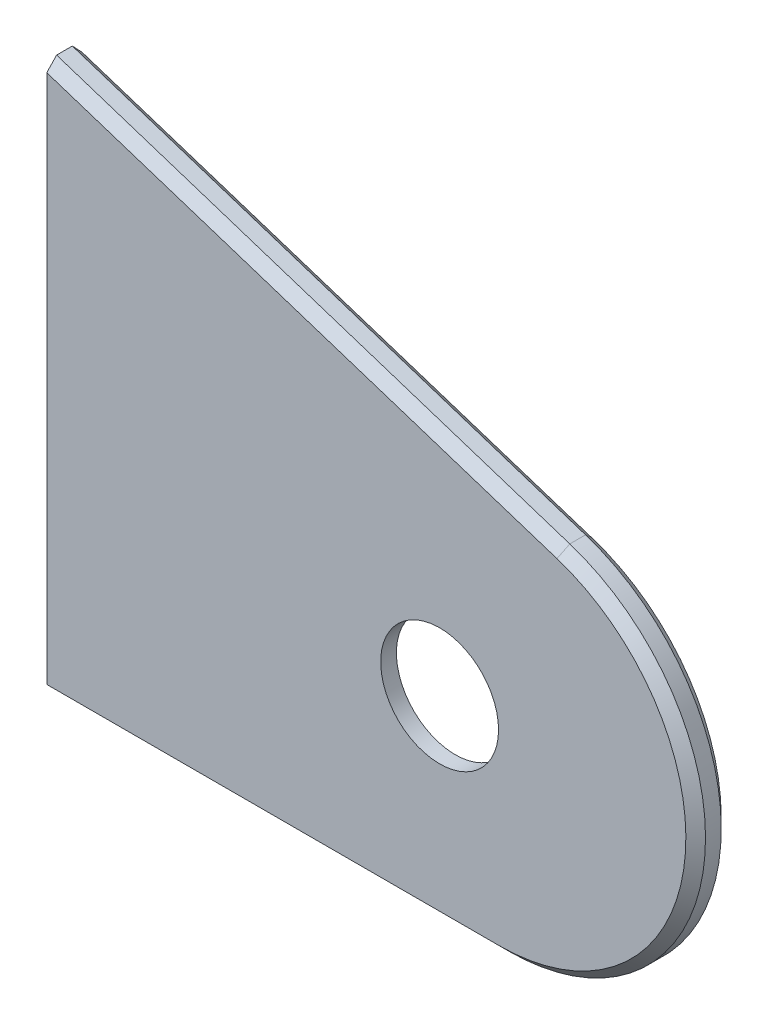
ISO-10303-21;
HEADER;
FILE_DESCRIPTION(('STEP AP214'),'2;1');
FILE_NAME('part.step','',(''),(''),'','','');
FILE_SCHEMA(('AUTOMOTIVE_DESIGN { 1 0 10303 214 1 1 1 1 }'));
ENDSEC;
DATA;
#1=APPLICATION_CONTEXT('core data for automotive mechanical design processes');
#2=APPLICATION_PROTOCOL_DEFINITION('international standard','automotive_design',2000,#1);
#3=PRODUCT_CONTEXT('',#1,'mechanical');
#4=PRODUCT('Part','Part','',(#3));
#5=PRODUCT_RELATED_PRODUCT_CATEGORY('part','',(#4));
#6=PRODUCT_DEFINITION_FORMATION('','',#4);
#7=PRODUCT_DEFINITION_CONTEXT('part definition',#1,'design');
#8=PRODUCT_DEFINITION('design','',#6,#7);
#9=PRODUCT_DEFINITION_SHAPE('','',#8);
#10=(LENGTH_UNIT() NAMED_UNIT(*) SI_UNIT(.MILLI.,.METRE.));
#11=(NAMED_UNIT(*) PLANE_ANGLE_UNIT() SI_UNIT($,.RADIAN.));
#12=(NAMED_UNIT(*) SI_UNIT($,.STERADIAN.) SOLID_ANGLE_UNIT());
#13=UNCERTAINTY_MEASURE_WITH_UNIT(LENGTH_MEASURE(1.E-05),#10,'distance_accuracy_value','');
#14=(GEOMETRIC_REPRESENTATION_CONTEXT(3) GLOBAL_UNCERTAINTY_ASSIGNED_CONTEXT((#13)) GLOBAL_UNIT_ASSIGNED_CONTEXT((#10,
#11,#12)) REPRESENTATION_CONTEXT('',''));
#15=CARTESIAN_POINT('',(0.,0.,0.));
#16=DIRECTION('',(0.,0.,1.));
#17=DIRECTION('',(1.,0.,0.));
#18=AXIS2_PLACEMENT_3D('',#15,#16,#17);
#19=CARTESIAN_POINT('',(0.,0.,0.));
#20=DIRECTION('',(0.,0.,-1.));
#21=DIRECTION('',(-1.,0.,0.));
#22=AXIS2_PLACEMENT_3D('',#19,#20,#21);
#23=PLANE('',#22);
#24=DIRECTION('',(1.,0.,0.));
#25=VECTOR('',#24,1.);
#26=CARTESIAN_POINT('',(30.,10.,0.));
#27=LINE('',#26,#25);
#28=CARTESIAN_POINT('',(47.3205080756887,10.,0.));
#29=VERTEX_POINT('',#28);
#30=CARTESIAN_POINT('',(230.376238941563,10.,0.));
#31=VERTEX_POINT('',#30);
#32=EDGE_CURVE('E212',#29,#31,#27,.T.);
#33=ORIENTED_EDGE('',*,*,#32,.F.);
#34=CARTESIAN_POINT('',(47.3205080756888,20.,0.));
#35=DIRECTION('',(0.,0.,-1.));
#36=DIRECTION('',(-1.,0.,0.));
#37=AXIS2_PLACEMENT_3D('',#34,#35,#36);
#38=CIRCLE('',#37,10.);
#39=CARTESIAN_POINT('',(38.6602540378444,25.,0.));
#40=VERTEX_POINT('',#39);
#41=EDGE_CURVE('E281',#29,#40,#38,.T.);
#42=ORIENTED_EDGE('',*,*,#41,.T.);
#43=DIRECTION('',(-0.499999999999998,-0.86602540378444,0.));
#44=VECTOR('',#43,1.);
#45=CARTESIAN_POINT('',(30.,10.,0.));
#46=LINE('',#45,#44);
#47=CARTESIAN_POINT('',(147.361565015534,213.276193462705,0.));
#48=VERTEX_POINT('',#47);
#49=EDGE_CURVE('E209',#48,#40,#46,.T.);
#50=ORIENTED_EDGE('',*,*,#49,.F.);
#51=CARTESIAN_POINT('',(156.021819053379,208.276193462705,0.));
#52=DIRECTION('',(0.,0.,-1.));
#53=DIRECTION('',(-1.,0.,0.));
#54=AXIS2_PLACEMENT_3D('',#51,#52,#53);
#55=CIRCLE('',#54,10.);
#56=CARTESIAN_POINT('',(159.111988997128,217.786758625656,0.));
#57=VERTEX_POINT('',#56);
#58=EDGE_CURVE('E279',#48,#57,#55,.T.);
#59=ORIENTED_EDGE('',*,*,#58,.T.);
#60=DIRECTION('',(-0.951056516295152,0.309016994374952,0.));
#61=VECTOR('',#60,1.);
#62=CARTESIAN_POINT('',(151.410485181509,220.289128905964,0.));
#63=LINE('',#62,#61);
#64=CARTESIAN_POINT('',(258.187768435309,185.595086466564,0.));
#65=VERTEX_POINT('',#64);
#66=EDGE_CURVE('E216',#65,#57,#63,.T.);
#67=ORIENTED_EDGE('',*,*,#66,.F.);
#68=CARTESIAN_POINT('',(230.376238941563,100.,0.));
#69=DIRECTION('',(0.,0.,1.));
#70=DIRECTION('',(1.,0.,0.));
#71=AXIS2_PLACEMENT_3D('',#68,#69,#70);
#72=CIRCLE('',#71,90.);
#73=EDGE_CURVE('E186',#31,#65,#72,.T.);
#74=ORIENTED_EDGE('',*,*,#73,.F.);
#75=EDGE_LOOP('',(#33,#42,#50,#59,#67,#74));
#76=FACE_BOUND('',#75,.T.);
#77=CARTESIAN_POINT('',(200.,99.9999999999999,0.));
#78=DIRECTION('',(0.,0.,1.));
#79=DIRECTION('',(1.,0.,0.));
#80=AXIS2_PLACEMENT_3D('',#77,#78,#79);
#81=CIRCLE('',#80,30.);
#82=CARTESIAN_POINT('',(230.,99.9999999999999,0.));
#83=VERTEX_POINT('',#82);
#84=EDGE_CURVE('E239',#83,#83,#81,.T.);
#85=ORIENTED_EDGE('',*,*,#84,.T.);
#86=EDGE_LOOP('',(#85));
#87=FACE_BOUND('',#86,.T.);
#88=ADVANCED_FACE('F36',(#76,#87),#23,.T.);
#89=CARTESIAN_POINT('',(0.,0.,8.));
#90=DIRECTION('',(0.,0.,-1.));
#91=DIRECTION('',(-1.,0.,0.));
#92=AXIS2_PLACEMENT_3D('',#89,#90,#91);
#93=PLANE('',#92);
#94=DIRECTION('',(0.,-1.,0.));
#95=VECTOR('',#94,1.);
#96=CARTESIAN_POINT('',(0.,0.,8.));
#97=LINE('',#96,#95);
#98=CARTESIAN_POINT('',(0.,274.742688878809,8.));
#99=VERTEX_POINT('',#98);
#100=CARTESIAN_POINT('',(0.,5.00000000000012,8.));
#101=VERTEX_POINT('',#100);
#102=EDGE_CURVE('E243',#99,#101,#97,.T.);
#103=ORIENTED_EDGE('',*,*,#102,.T.);
#104=DIRECTION('',(1.,0.,0.));
#105=VECTOR('',#104,1.);
#106=CARTESIAN_POINT('',(0.,5.00000000000012,8.));
#107=LINE('',#106,#105);
#108=CARTESIAN_POINT('',(230.376238941563,5.0000000000001,8.));
#109=VERTEX_POINT('',#108);
#110=EDGE_CURVE('E11',#101,#109,#107,.T.);
#111=ORIENTED_EDGE('',*,*,#110,.T.);
#112=CARTESIAN_POINT('',(230.376238941563,100.,8.));
#113=DIRECTION('',(0.,0.,-1.));
#114=DIRECTION('',(-1.,0.,0.));
#115=AXIS2_PLACEMENT_3D('',#112,#113,#114);
#116=CIRCLE('',#115,94.9999999999999);
#117=CARTESIAN_POINT('',(259.732853407183,190.350369048039,8.));
#118=VERTEX_POINT('',#117);
#119=EDGE_CURVE('E53',#109,#118,#116,.F.);
#120=ORIENTED_EDGE('',*,*,#119,.T.);
#121=DIRECTION('',(-0.951056516295152,0.309016994374951,0.));
#122=VECTOR('',#121,1.);
#123=CARTESIAN_POINT('',(80.7448503490724,248.507096631016,8.));
#124=LINE('',#123,#122);
#125=EDGE_CURVE('E46',#118,#99,#124,.T.);
#126=ORIENTED_EDGE('',*,*,#125,.T.);
#127=EDGE_LOOP('',(#103,#111,#120,#126));
#128=FACE_BOUND('',#127,.T.);
#129=CARTESIAN_POINT('',(200.,99.9999999999999,8.));
#130=DIRECTION('',(0.,0.,1.));
#131=DIRECTION('',(1.,0.,0.));
#132=AXIS2_PLACEMENT_3D('',#129,#130,#131);
#133=CIRCLE('',#132,30.);
#134=CARTESIAN_POINT('',(230.,99.9999999999999,8.));
#135=VERTEX_POINT('',#134);
#136=EDGE_CURVE('E240',#135,#135,#133,.T.);
#137=ORIENTED_EDGE('',*,*,#136,.F.);
#138=EDGE_LOOP('',(#137));
#139=FACE_BOUND('',#138,.T.);
#140=ADVANCED_FACE('F345',(#128,#139),#93,.F.);
#141=CARTESIAN_POINT('',(861.751390409059,0.,8.));
#142=DIRECTION('',(0.,1.,0.));
#143=DIRECTION('',(-1.,0.,0.));
#144=AXIS2_PLACEMENT_3D('',#141,#142,#143);
#145=PLANE('',#144);
#146=DIRECTION('',(0.,0.,-1.));
#147=VECTOR('',#146,1.);
#148=CARTESIAN_POINT('',(0.,0.,8.));
#149=LINE('',#148,#147);
#150=CARTESIAN_POINT('',(0.,0.,2.99999999999993));
#151=VERTEX_POINT('',#150);
#152=CARTESIAN_POINT('',(0.,0.,-5.00000000000009));
#153=VERTEX_POINT('',#152);
#154=EDGE_CURVE('E248',#151,#153,#149,.T.);
#155=ORIENTED_EDGE('',*,*,#154,.T.);
#156=DIRECTION('',(1.,0.,0.));
#157=VECTOR('',#156,1.);
#158=CARTESIAN_POINT('',(861.751390409059,0.,-5.00000000000009));
#159=LINE('',#158,#157);
#160=CARTESIAN_POINT('',(230.376238941563,0.,-5.0000000000001));
#161=VERTEX_POINT('',#160);
#162=EDGE_CURVE('E306',#153,#161,#159,.T.);
#163=ORIENTED_EDGE('',*,*,#162,.T.);
#164=DIRECTION('',(0.,0.,-1.));
#165=VECTOR('',#164,1.);
#166=CARTESIAN_POINT('',(230.376238941563,0.,8.));
#167=LINE('',#166,#165);
#168=CARTESIAN_POINT('',(230.376238941563,0.,2.99999999999993));
#169=VERTEX_POINT('',#168);
#170=EDGE_CURVE('E257',#161,#169,#167,.F.);
#171=ORIENTED_EDGE('',*,*,#170,.T.);
#172=DIRECTION('',(-1.,0.,0.));
#173=VECTOR('',#172,1.);
#174=CARTESIAN_POINT('',(861.751390409059,0.,2.99999999999993));
#175=LINE('',#174,#173);
#176=EDGE_CURVE('E304',#169,#151,#175,.T.);
#177=ORIENTED_EDGE('',*,*,#176,.T.);
#178=EDGE_LOOP('',(#155,#163,#171,#177));
#179=FACE_BOUND('',#178,.T.);
#180=ADVANCED_FACE('F354',(#179),#145,.F.);
#181=CARTESIAN_POINT('',(0.,280.,8.));
#182=DIRECTION('',(-0.309016994374951,-0.951056516295152,0.));
#183=DIRECTION('',(0.951056516295152,-0.309016994374951,0.));
#184=AXIS2_PLACEMENT_3D('',#181,#182,#183);
#185=PLANE('',#184);
#186=DIRECTION('',(0.,0.,-1.));
#187=VECTOR('',#186,1.);
#188=CARTESIAN_POINT('',(261.277938379058,195.105651629515,8.));
#189=LINE('',#188,#187);
#190=CARTESIAN_POINT('',(261.277938379058,195.105651629515,2.99999999999993));
#191=VERTEX_POINT('',#190);
#192=CARTESIAN_POINT('',(261.277938379058,195.105651629515,-5.0000000000001));
#193=VERTEX_POINT('',#192);
#194=EDGE_CURVE('E254',#191,#193,#189,.T.);
#195=ORIENTED_EDGE('',*,*,#194,.T.);
#196=DIRECTION('',(-0.951056516295152,0.309016994374951,0.));
#197=VECTOR('',#196,1.);
#198=CARTESIAN_POINT('',(0.,280.,-5.00000000000009));
#199=LINE('',#198,#197);
#200=CARTESIAN_POINT('',(0.,280.,-5.00000000000009));
#201=VERTEX_POINT('',#200);
#202=EDGE_CURVE('E325',#193,#201,#199,.T.);
#203=ORIENTED_EDGE('',*,*,#202,.T.);
#204=DIRECTION('',(0.,0.,-1.));
#205=VECTOR('',#204,1.);
#206=CARTESIAN_POINT('',(0.,280.,8.));
#207=LINE('',#206,#205);
#208=CARTESIAN_POINT('',(0.,280.,2.99999999999992));
#209=VERTEX_POINT('',#208);
#210=EDGE_CURVE('E251',#209,#201,#207,.T.);
#211=ORIENTED_EDGE('',*,*,#210,.F.);
#212=DIRECTION('',(0.951056516295152,-0.309016994374951,0.));
#213=VECTOR('',#212,1.);
#214=CARTESIAN_POINT('',(0.,280.,2.99999999999992));
#215=LINE('',#214,#213);
#216=EDGE_CURVE('E323',#209,#191,#215,.T.);
#217=ORIENTED_EDGE('',*,*,#216,.T.);
#218=EDGE_LOOP('',(#195,#203,#211,#217));
#219=FACE_BOUND('',#218,.T.);
#220=ADVANCED_FACE('F363',(#219),#185,.F.);
#221=CARTESIAN_POINT('',(0.,0.,8.));
#222=DIRECTION('',(1.,0.,0.));
#223=DIRECTION('',(0.,0.,-1.));
#224=AXIS2_PLACEMENT_3D('',#221,#222,#223);
#225=PLANE('',#224);
#226=DIRECTION('',(0.,-1.,0.));
#227=VECTOR('',#226,1.);
#228=CARTESIAN_POINT('',(0.,280.,-10.));
#229=LINE('',#228,#227);
#230=CARTESIAN_POINT('',(0.,274.742688878809,-10.));
#231=VERTEX_POINT('',#230);
#232=CARTESIAN_POINT('',(0.,4.99999999999995,-10.));
#233=VERTEX_POINT('',#232);
#234=EDGE_CURVE('E229',#231,#233,#229,.T.);
#235=ORIENTED_EDGE('',*,*,#234,.T.);
#236=DIRECTION('',(0.,0.707106781186551,-0.707106781186545));
#237=VECTOR('',#236,1.);
#238=CARTESIAN_POINT('',(0.,0.,-5.00000000000009));
#239=LINE('',#238,#237);
#240=EDGE_CURVE('E321',#233,#153,#239,.F.);
#241=ORIENTED_EDGE('',*,*,#240,.T.);
#242=ORIENTED_EDGE('',*,*,#154,.F.);
#243=DIRECTION('',(0.,-0.707106781186551,-0.707106781186545));
#244=VECTOR('',#243,1.);
#245=CARTESIAN_POINT('',(0.,5.00000000000012,8.));
#246=LINE('',#245,#244);
#247=EDGE_CURVE('E317',#151,#101,#246,.F.);
#248=ORIENTED_EDGE('',*,*,#247,.T.);
#249=ORIENTED_EDGE('',*,*,#102,.F.);
#250=DIRECTION('',(0.,-0.72461704006745,0.689151757774649));
#251=VECTOR('',#250,1.);
#252=CARTESIAN_POINT('',(0.,260.96717026782,21.1012967403261));
#253=LINE('',#252,#251);
#254=EDGE_CURVE('E315',#99,#209,#253,.F.);
#255=ORIENTED_EDGE('',*,*,#254,.T.);
#256=ORIENTED_EDGE('',*,*,#210,.T.);
#257=DIRECTION('',(0.,0.724617040067451,0.689151757774647));
#258=VECTOR('',#257,1.);
#259=CARTESIAN_POINT('',(0.,280.,-5.00000000000009));
#260=LINE('',#259,#258);
#261=EDGE_CURVE('E319',#201,#231,#260,.F.);
#262=ORIENTED_EDGE('',*,*,#261,.T.);
#263=EDGE_LOOP('',(#235,#241,#242,#248,#249,#255,#256,#262));
#264=FACE_BOUND('',#263,.T.);
#265=ADVANCED_FACE('F348',(#264),#225,.F.);
#266=CARTESIAN_POINT('',(200.,99.9999999999999,8.));
#267=DIRECTION('',(0.,0.,-1.));
#268=DIRECTION('',(-1.,0.,0.));
#269=AXIS2_PLACEMENT_3D('',#266,#267,#268);
#270=CYLINDRICAL_SURFACE('',#269,30.);
#271=ORIENTED_EDGE('',*,*,#136,.T.);
#272=EDGE_LOOP('',(#271));
#273=FACE_BOUND('',#272,.T.);
#274=ORIENTED_EDGE('',*,*,#84,.F.);
#275=EDGE_LOOP('',(#274));
#276=FACE_BOUND('',#275,.T.);
#277=ADVANCED_FACE('F452',(#273,#276),#270,.F.);
#278=CARTESIAN_POINT('',(230.376238941563,100.,8.));
#279=DIRECTION('',(0.,0.,-1.));
#280=DIRECTION('',(-1.,0.,0.));
#281=AXIS2_PLACEMENT_3D('',#278,#279,#280);
#282=CYLINDRICAL_SURFACE('',#281,100.);
#283=ORIENTED_EDGE('',*,*,#170,.F.);
#284=CARTESIAN_POINT('',(230.376238941563,100.,-5.0000000000001));
#285=DIRECTION('',(0.,0.,1.));
#286=DIRECTION('',(1.,0.,0.));
#287=AXIS2_PLACEMENT_3D('',#284,#285,#286);
#288=CIRCLE('',#287,100.);
#289=EDGE_CURVE('E329',#161,#193,#288,.T.);
#290=ORIENTED_EDGE('',*,*,#289,.T.);
#291=ORIENTED_EDGE('',*,*,#194,.F.);
#292=CARTESIAN_POINT('',(230.376238941563,100.,2.99999999999993));
#293=DIRECTION('',(0.,0.,-1.));
#294=DIRECTION('',(-1.,0.,0.));
#295=AXIS2_PLACEMENT_3D('',#292,#293,#294);
#296=CIRCLE('',#295,100.);
#297=EDGE_CURVE('E327',#191,#169,#296,.T.);
#298=ORIENTED_EDGE('',*,*,#297,.T.);
#299=EDGE_LOOP('',(#283,#290,#291,#298));
#300=FACE_BOUND('',#299,.T.);
#301=ADVANCED_FACE('F358',(#300),#282,.T.);
#302=CARTESIAN_POINT('',(230.376238941563,100.,-10.));
#303=DIRECTION('',(0.,0.,1.));
#304=DIRECTION('',(1.,0.,0.));
#305=AXIS2_PLACEMENT_3D('',#302,#303,#304);
#306=PLANE('',#305);
#307=DIRECTION('',(-0.951056516295152,0.309016994374952,0.));
#308=VECTOR('',#307,1.);
#309=CARTESIAN_POINT('',(151.410485181509,220.289128905964,-10.));
#310=LINE('',#309,#308);
#311=CARTESIAN_POINT('',(258.187768435309,185.595086466564,-10.));
#312=VERTEX_POINT('',#311);
#313=CARTESIAN_POINT('',(159.111988997128,217.786758625656,-10.));
#314=VERTEX_POINT('',#313);
#315=EDGE_CURVE('E193',#312,#314,#310,.T.);
#316=ORIENTED_EDGE('',*,*,#315,.T.);
#317=CARTESIAN_POINT('',(156.021819053379,208.276193462705,-10.));
#318=DIRECTION('',(0.,0.,1.));
#319=DIRECTION('',(1.,0.,0.));
#320=AXIS2_PLACEMENT_3D('',#317,#318,#319);
#321=CIRCLE('',#320,10.);
#322=CARTESIAN_POINT('',(147.361565015534,213.276193462705,-10.));
#323=VERTEX_POINT('',#322);
#324=EDGE_CURVE('E300',#314,#323,#321,.T.);
#325=ORIENTED_EDGE('',*,*,#324,.T.);
#326=DIRECTION('',(-0.499999999999998,-0.86602540378444,0.));
#327=VECTOR('',#326,1.);
#328=CARTESIAN_POINT('',(30.,10.,-10.));
#329=LINE('',#328,#327);
#330=CARTESIAN_POINT('',(38.6602540378444,25.,-10.));
#331=VERTEX_POINT('',#330);
#332=EDGE_CURVE('E205',#323,#331,#329,.T.);
#333=ORIENTED_EDGE('',*,*,#332,.T.);
#334=CARTESIAN_POINT('',(47.3205080756888,20.,-10.));
#335=DIRECTION('',(0.,0.,1.));
#336=DIRECTION('',(1.,0.,0.));
#337=AXIS2_PLACEMENT_3D('',#334,#335,#336);
#338=CIRCLE('',#337,10.);
#339=CARTESIAN_POINT('',(47.3205080756887,10.,-10.));
#340=VERTEX_POINT('',#339);
#341=EDGE_CURVE('E296',#331,#340,#338,.T.);
#342=ORIENTED_EDGE('',*,*,#341,.T.);
#343=DIRECTION('',(1.,0.,0.));
#344=VECTOR('',#343,1.);
#345=CARTESIAN_POINT('',(30.,10.,-10.));
#346=LINE('',#345,#344);
#347=CARTESIAN_POINT('',(230.376238941563,10.,-10.));
#348=VERTEX_POINT('',#347);
#349=EDGE_CURVE('E203',#340,#348,#346,.T.);
#350=ORIENTED_EDGE('',*,*,#349,.T.);
#351=CARTESIAN_POINT('',(230.376238941563,100.,-10.));
#352=DIRECTION('',(0.,0.,1.));
#353=DIRECTION('',(1.,0.,0.));
#354=AXIS2_PLACEMENT_3D('',#351,#352,#353);
#355=CIRCLE('',#354,90.);
#356=EDGE_CURVE('E183',#348,#312,#355,.T.);
#357=ORIENTED_EDGE('',*,*,#356,.T.);
#358=EDGE_LOOP('',(#316,#325,#333,#342,#350,#357));
#359=FACE_BOUND('',#358,.T.);
#360=DIRECTION('',(0.,-1.,0.));
#361=VECTOR('',#360,1.);
#362=CARTESIAN_POINT('',(10.,266.236180795288,-10.));
#363=LINE('',#362,#361);
#364=CARTESIAN_POINT('',(10.,252.472361590576,-10.));
#365=VERTEX_POINT('',#364);
#366=CARTESIAN_POINT('',(10.,72.6794919243115,-10.));
#367=VERTEX_POINT('',#366);
#368=EDGE_CURVE('E222',#365,#367,#363,.T.);
#369=ORIENTED_EDGE('',*,*,#368,.T.);
#370=CARTESIAN_POINT('',(20.,72.6794919243115,-10.));
#371=DIRECTION('',(0.,0.,1.));
#372=DIRECTION('',(1.,0.,0.));
#373=AXIS2_PLACEMENT_3D('',#370,#371,#372);
#374=CIRCLE('',#373,10.);
#375=CARTESIAN_POINT('',(28.6602540378444,67.6794919243115,-10.));
#376=VERTEX_POINT('',#375);
#377=EDGE_CURVE('E294',#367,#376,#374,.T.);
#378=ORIENTED_EDGE('',*,*,#377,.T.);
#379=DIRECTION('',(0.499999999999998,0.86602540378444,0.));
#380=VECTOR('',#379,1.);
#381=CARTESIAN_POINT('',(10.,35.3589838486225,-10.));
#382=LINE('',#381,#380);
#383=CARTESIAN_POINT('',(116.066888860251,219.072224355339,-10.));
#384=VERTEX_POINT('',#383);
#385=EDGE_CURVE('E226',#376,#384,#382,.T.);
#386=ORIENTED_EDGE('',*,*,#385,.T.);
#387=CARTESIAN_POINT('',(107.406634822406,224.072224355339,-10.));
#388=DIRECTION('',(0.,0.,1.));
#389=DIRECTION('',(1.,0.,0.));
#390=AXIS2_PLACEMENT_3D('',#387,#388,#389);
#391=CIRCLE('',#390,10.);
#392=CARTESIAN_POINT('',(110.496804766156,233.582789518291,-10.));
#393=VERTEX_POINT('',#392);
#394=EDGE_CURVE('E298',#384,#393,#391,.T.);
#395=ORIENTED_EDGE('',*,*,#394,.T.);
#396=DIRECTION('',(-0.951056516295152,0.309016994374951,0.));
#397=VECTOR('',#396,1.);
#398=CARTESIAN_POINT('',(10.,266.236180795288,-10.));
#399=LINE('',#398,#397);
#400=CARTESIAN_POINT('',(23.0901699437495,261.982926753528,-10.));
#401=VERTEX_POINT('',#400);
#402=EDGE_CURVE('E219',#393,#401,#399,.T.);
#403=ORIENTED_EDGE('',*,*,#402,.T.);
#404=CARTESIAN_POINT('',(20.,252.472361590576,-10.));
#405=DIRECTION('',(0.,0.,1.));
#406=DIRECTION('',(1.,0.,0.));
#407=AXIS2_PLACEMENT_3D('',#404,#405,#406);
#408=CIRCLE('',#407,10.);
#409=EDGE_CURVE('E302',#401,#365,#408,.T.);
#410=ORIENTED_EDGE('',*,*,#409,.T.);
#411=EDGE_LOOP('',(#369,#378,#386,#395,#403,#410));
#412=FACE_BOUND('',#411,.T.);
#413=CARTESIAN_POINT('',(230.376238941563,100.,-10.));
#414=DIRECTION('',(0.,0.,1.));
#415=DIRECTION('',(1.,0.,0.));
#416=AXIS2_PLACEMENT_3D('',#413,#414,#415);
#417=CIRCLE('',#416,95.0000000000001);
#418=CARTESIAN_POINT('',(259.732853407183,190.35036904804,-10.));
#419=VERTEX_POINT('',#418);
#420=CARTESIAN_POINT('',(230.376238941563,4.99999999999994,-10.));
#421=VERTEX_POINT('',#420);
#422=EDGE_CURVE('E309',#419,#421,#417,.F.);
#423=ORIENTED_EDGE('',*,*,#422,.T.);
#424=DIRECTION('',(-1.,0.,0.));
#425=VECTOR('',#424,1.);
#426=CARTESIAN_POINT('',(230.376238941563,4.99999999999995,-10.));
#427=LINE('',#426,#425);
#428=EDGE_CURVE('E313',#421,#233,#427,.T.);
#429=ORIENTED_EDGE('',*,*,#428,.T.);
#430=ORIENTED_EDGE('',*,*,#234,.F.);
#431=DIRECTION('',(0.951056516295152,-0.309016994374951,0.));
#432=VECTOR('',#431,1.);
#433=CARTESIAN_POINT('',(259.732853407183,190.35036904804,-10.));
#434=LINE('',#433,#432);
#435=EDGE_CURVE('E311',#231,#419,#434,.T.);
#436=ORIENTED_EDGE('',*,*,#435,.T.);
#437=EDGE_LOOP('',(#423,#429,#430,#436));
#438=FACE_BOUND('',#437,.T.);
#439=ADVANCED_FACE('F200',(#359,#412,#438),#306,.F.);
#440=CARTESIAN_POINT('',(10.,266.236180795288,-10.));
#441=DIRECTION('',(0.309016994374951,0.951056516295152,0.));
#442=DIRECTION('',(-0.951056516295152,0.309016994374951,0.));
#443=AXIS2_PLACEMENT_3D('',#440,#441,#442);
#444=PLANE('',#443);
#445=ORIENTED_EDGE('',*,*,#402,.F.);
#446=DIRECTION('',(0.,0.,1.));
#447=VECTOR('',#446,1.);
#448=CARTESIAN_POINT('',(110.496804766156,233.582789518291,0.));
#449=LINE('',#448,#447);
#450=CARTESIAN_POINT('',(110.496804766156,233.582789518291,0.));
#451=VERTEX_POINT('',#450);
#452=EDGE_CURVE('E290',#393,#451,#449,.T.);
#453=ORIENTED_EDGE('',*,*,#452,.T.);
#454=DIRECTION('',(-0.951056516295152,0.309016994374951,0.));
#455=VECTOR('',#454,1.);
#456=CARTESIAN_POINT('',(10.,266.236180795288,0.));
#457=LINE('',#456,#455);
#458=CARTESIAN_POINT('',(23.0901699437495,261.982926753528,0.));
#459=VERTEX_POINT('',#458);
#460=EDGE_CURVE('E189',#451,#459,#457,.T.);
#461=ORIENTED_EDGE('',*,*,#460,.T.);
#462=DIRECTION('',(0.,0.,1.));
#463=VECTOR('',#462,1.);
#464=CARTESIAN_POINT('',(23.0901699437495,261.982926753528,-10.));
#465=LINE('',#464,#463);
#466=EDGE_CURVE('E288',#459,#401,#465,.F.);
#467=ORIENTED_EDGE('',*,*,#466,.T.);
#468=EDGE_LOOP('',(#445,#453,#461,#467));
#469=FACE_BOUND('',#468,.T.);
#470=ADVANCED_FACE('F427',(#469),#444,.F.);
#471=CARTESIAN_POINT('',(10.,35.3589838486225,-10.));
#472=DIRECTION('',(0.86602540378444,-0.499999999999998,0.));
#473=DIRECTION('',(0.499999999999998,0.86602540378444,0.));
#474=AXIS2_PLACEMENT_3D('',#471,#472,#473);
#475=PLANE('',#474);
#476=ORIENTED_EDGE('',*,*,#385,.F.);
#477=DIRECTION('',(0.,0.,1.));
#478=VECTOR('',#477,1.);
#479=CARTESIAN_POINT('',(28.6602540378444,67.6794919243115,0.));
#480=LINE('',#479,#478);
#481=CARTESIAN_POINT('',(28.6602540378444,67.6794919243115,0.));
#482=VERTEX_POINT('',#481);
#483=EDGE_CURVE('E262',#376,#482,#480,.T.);
#484=ORIENTED_EDGE('',*,*,#483,.T.);
#485=DIRECTION('',(0.499999999999998,0.86602540378444,0.));
#486=VECTOR('',#485,1.);
#487=CARTESIAN_POINT('',(10.,35.3589838486225,0.));
#488=LINE('',#487,#486);
#489=CARTESIAN_POINT('',(116.066888860251,219.072224355339,0.));
#490=VERTEX_POINT('',#489);
#491=EDGE_CURVE('E223',#482,#490,#488,.T.);
#492=ORIENTED_EDGE('',*,*,#491,.T.);
#493=DIRECTION('',(0.,0.,1.));
#494=VECTOR('',#493,1.);
#495=CARTESIAN_POINT('',(116.066888860251,219.072224355339,-10.));
#496=LINE('',#495,#494);
#497=EDGE_CURVE('E260',#490,#384,#496,.F.);
#498=ORIENTED_EDGE('',*,*,#497,.T.);
#499=EDGE_LOOP('',(#476,#484,#492,#498));
#500=FACE_BOUND('',#499,.T.);
#501=ADVANCED_FACE('F418',(#500),#475,.F.);
#502=CARTESIAN_POINT('',(10.,266.236180795288,-10.));
#503=DIRECTION('',(-1.,0.,0.));
#504=DIRECTION('',(0.,-1.,0.));
#505=AXIS2_PLACEMENT_3D('',#502,#503,#504);
#506=PLANE('',#505);
#507=DIRECTION('',(0.,-1.,0.));
#508=VECTOR('',#507,1.);
#509=CARTESIAN_POINT('',(10.,266.236180795288,0.));
#510=LINE('',#509,#508);
#511=CARTESIAN_POINT('',(10.,252.472361590576,0.));
#512=VERTEX_POINT('',#511);
#513=CARTESIAN_POINT('',(10.,72.6794919243115,0.));
#514=VERTEX_POINT('',#513);
#515=EDGE_CURVE('E232',#512,#514,#510,.T.);
#516=ORIENTED_EDGE('',*,*,#515,.T.);
#517=DIRECTION('',(0.,0.,1.));
#518=VECTOR('',#517,1.);
#519=CARTESIAN_POINT('',(10.,72.6794919243115,-10.));
#520=LINE('',#519,#518);
#521=EDGE_CURVE('E274',#514,#367,#520,.F.);
#522=ORIENTED_EDGE('',*,*,#521,.T.);
#523=ORIENTED_EDGE('',*,*,#368,.F.);
#524=DIRECTION('',(0.,0.,1.));
#525=VECTOR('',#524,1.);
#526=CARTESIAN_POINT('',(10.,252.472361590576,0.));
#527=LINE('',#526,#525);
#528=EDGE_CURVE('E271',#365,#512,#527,.T.);
#529=ORIENTED_EDGE('',*,*,#528,.T.);
#530=EDGE_LOOP('',(#516,#522,#523,#529));
#531=FACE_BOUND('',#530,.T.);
#532=ADVANCED_FACE('F435',(#531),#506,.F.);
#533=CARTESIAN_POINT('',(30.,10.,-10.));
#534=DIRECTION('',(-0.86602540378444,0.499999999999998,0.));
#535=DIRECTION('',(-0.499999999999998,-0.86602540378444,0.));
#536=AXIS2_PLACEMENT_3D('',#533,#534,#535);
#537=PLANE('',#536);
#538=ORIENTED_EDGE('',*,*,#49,.T.);
#539=DIRECTION('',(0.,0.,1.));
#540=VECTOR('',#539,1.);
#541=CARTESIAN_POINT('',(38.6602540378444,25.,-10.));
#542=LINE('',#541,#540);
#543=EDGE_CURVE('E286',#40,#331,#542,.F.);
#544=ORIENTED_EDGE('',*,*,#543,.T.);
#545=ORIENTED_EDGE('',*,*,#332,.F.);
#546=DIRECTION('',(0.,0.,1.));
#547=VECTOR('',#546,1.);
#548=CARTESIAN_POINT('',(147.361565015534,213.276193462705,0.));
#549=LINE('',#548,#547);
#550=EDGE_CURVE('E283',#323,#48,#549,.T.);
#551=ORIENTED_EDGE('',*,*,#550,.T.);
#552=EDGE_LOOP('',(#538,#544,#545,#551));
#553=FACE_BOUND('',#552,.T.);
#554=ADVANCED_FACE('F438',(#553),#537,.F.);
#555=CARTESIAN_POINT('',(151.410485181509,220.289128905964,-10.));
#556=DIRECTION('',(0.309016994374952,0.951056516295152,0.));
#557=DIRECTION('',(-0.951056516295152,0.309016994374952,0.));
#558=AXIS2_PLACEMENT_3D('',#555,#556,#557);
#559=PLANE('',#558);
#560=ORIENTED_EDGE('',*,*,#66,.T.);
#561=DIRECTION('',(0.,0.,1.));
#562=VECTOR('',#561,1.);
#563=CARTESIAN_POINT('',(159.111988997128,217.786758625656,-10.));
#564=LINE('',#563,#562);
#565=EDGE_CURVE('E196',#57,#314,#564,.F.);
#566=ORIENTED_EDGE('',*,*,#565,.T.);
#567=ORIENTED_EDGE('',*,*,#315,.F.);
#568=DIRECTION('',(0.,0.,1.));
#569=VECTOR('',#568,1.);
#570=CARTESIAN_POINT('',(258.187768435309,185.595086466564,-10.));
#571=LINE('',#570,#569);
#572=EDGE_CURVE('E178',#312,#65,#571,.T.);
#573=ORIENTED_EDGE('',*,*,#572,.T.);
#574=EDGE_LOOP('',(#560,#566,#567,#573));
#575=FACE_BOUND('',#574,.T.);
#576=ADVANCED_FACE('F194',(#575),#559,.F.);
#577=CARTESIAN_POINT('',(230.376238941563,100.,-10.));
#578=DIRECTION('',(0.,0.,1.));
#579=DIRECTION('',(1.,0.,0.));
#580=AXIS2_PLACEMENT_3D('',#577,#578,#579);
#581=CYLINDRICAL_SURFACE('',#580,90.);
#582=ORIENTED_EDGE('',*,*,#73,.T.);
#583=ORIENTED_EDGE('',*,*,#572,.F.);
#584=ORIENTED_EDGE('',*,*,#356,.F.);
#585=DIRECTION('',(0.,0.,1.));
#586=VECTOR('',#585,1.);
#587=CARTESIAN_POINT('',(230.376238941563,10.,-10.));
#588=LINE('',#587,#586);
#589=EDGE_CURVE('E190',#348,#31,#588,.T.);
#590=ORIENTED_EDGE('',*,*,#589,.T.);
#591=EDGE_LOOP('',(#582,#583,#584,#590));
#592=FACE_BOUND('',#591,.T.);
#593=ADVANCED_FACE('F180',(#592),#581,.F.);
#594=CARTESIAN_POINT('',(30.,10.,-10.));
#595=DIRECTION('',(0.,-1.,0.));
#596=DIRECTION('',(1.,0.,0.));
#597=AXIS2_PLACEMENT_3D('',#594,#595,#596);
#598=PLANE('',#597);
#599=ORIENTED_EDGE('',*,*,#349,.F.);
#600=DIRECTION('',(0.,0.,1.));
#601=VECTOR('',#600,1.);
#602=CARTESIAN_POINT('',(47.3205080756888,10.,0.));
#603=LINE('',#602,#601);
#604=EDGE_CURVE('E276',#340,#29,#603,.T.);
#605=ORIENTED_EDGE('',*,*,#604,.T.);
#606=ORIENTED_EDGE('',*,*,#32,.T.);
#607=ORIENTED_EDGE('',*,*,#589,.F.);
#608=EDGE_LOOP('',(#599,#605,#606,#607));
#609=FACE_BOUND('',#608,.T.);
#610=ADVANCED_FACE('F401',(#609),#598,.F.);
#611=ORIENTED_EDGE('',*,*,#491,.F.);
#612=CARTESIAN_POINT('',(20.,72.6794919243115,0.));
#613=DIRECTION('',(0.,0.,-1.));
#614=DIRECTION('',(-1.,0.,0.));
#615=AXIS2_PLACEMENT_3D('',#612,#613,#614);
#616=CIRCLE('',#615,10.);
#617=EDGE_CURVE('E269',#482,#514,#616,.T.);
#618=ORIENTED_EDGE('',*,*,#617,.T.);
#619=ORIENTED_EDGE('',*,*,#515,.F.);
#620=CARTESIAN_POINT('',(20.,252.472361590576,0.));
#621=DIRECTION('',(0.,0.,-1.));
#622=DIRECTION('',(-1.,0.,0.));
#623=AXIS2_PLACEMENT_3D('',#620,#621,#622);
#624=CIRCLE('',#623,10.);
#625=EDGE_CURVE('E265',#512,#459,#624,.T.);
#626=ORIENTED_EDGE('',*,*,#625,.T.);
#627=ORIENTED_EDGE('',*,*,#460,.F.);
#628=CARTESIAN_POINT('',(107.406634822406,224.072224355339,0.));
#629=DIRECTION('',(0.,0.,-1.));
#630=DIRECTION('',(-1.,0.,0.));
#631=AXIS2_PLACEMENT_3D('',#628,#629,#630);
#632=CIRCLE('',#631,10.);
#633=EDGE_CURVE('E267',#451,#490,#632,.T.);
#634=ORIENTED_EDGE('',*,*,#633,.T.);
#635=EDGE_LOOP('',(#611,#618,#619,#626,#627,#634));
#636=FACE_BOUND('',#635,.T.);
#637=ADVANCED_FACE('F391',(#636),#23,.T.);
#638=CARTESIAN_POINT('',(20.,72.6794919243115,-10.));
#639=DIRECTION('',(0.,0.,-1.));
#640=DIRECTION('',(-1.,0.,0.));
#641=AXIS2_PLACEMENT_3D('',#638,#639,#640);
#642=CYLINDRICAL_SURFACE('',#641,10.);
#643=ORIENTED_EDGE('',*,*,#377,.F.);
#644=ORIENTED_EDGE('',*,*,#521,.F.);
#645=ORIENTED_EDGE('',*,*,#617,.F.);
#646=ORIENTED_EDGE('',*,*,#483,.F.);
#647=EDGE_LOOP('',(#643,#644,#645,#646));
#648=FACE_BOUND('',#647,.T.);
#649=ADVANCED_FACE('F400',(#648),#642,.F.);
#650=CARTESIAN_POINT('',(47.3205080756888,20.,-10.));
#651=DIRECTION('',(0.,0.,-1.));
#652=DIRECTION('',(-1.,0.,0.));
#653=AXIS2_PLACEMENT_3D('',#650,#651,#652);
#654=CYLINDRICAL_SURFACE('',#653,10.);
#655=ORIENTED_EDGE('',*,*,#341,.F.);
#656=ORIENTED_EDGE('',*,*,#543,.F.);
#657=ORIENTED_EDGE('',*,*,#41,.F.);
#658=ORIENTED_EDGE('',*,*,#604,.F.);
#659=EDGE_LOOP('',(#655,#656,#657,#658));
#660=FACE_BOUND('',#659,.T.);
#661=ADVANCED_FACE('F407',(#660),#654,.F.);
#662=CARTESIAN_POINT('',(107.406634822406,224.072224355339,-10.));
#663=DIRECTION('',(0.,0.,-1.));
#664=DIRECTION('',(-1.,0.,0.));
#665=AXIS2_PLACEMENT_3D('',#662,#663,#664);
#666=CYLINDRICAL_SURFACE('',#665,10.);
#667=ORIENTED_EDGE('',*,*,#394,.F.);
#668=ORIENTED_EDGE('',*,*,#497,.F.);
#669=ORIENTED_EDGE('',*,*,#633,.F.);
#670=ORIENTED_EDGE('',*,*,#452,.F.);
#671=EDGE_LOOP('',(#667,#668,#669,#670));
#672=FACE_BOUND('',#671,.T.);
#673=ADVANCED_FACE('F422',(#672),#666,.F.);
#674=CARTESIAN_POINT('',(156.021819053379,208.276193462705,-10.));
#675=DIRECTION('',(0.,0.,-1.));
#676=DIRECTION('',(-1.,0.,0.));
#677=AXIS2_PLACEMENT_3D('',#674,#675,#676);
#678=CYLINDRICAL_SURFACE('',#677,10.);
#679=ORIENTED_EDGE('',*,*,#324,.F.);
#680=ORIENTED_EDGE('',*,*,#565,.F.);
#681=ORIENTED_EDGE('',*,*,#58,.F.);
#682=ORIENTED_EDGE('',*,*,#550,.F.);
#683=EDGE_LOOP('',(#679,#680,#681,#682));
#684=FACE_BOUND('',#683,.T.);
#685=ADVANCED_FACE('F475',(#684),#678,.F.);
#686=CARTESIAN_POINT('',(20.,252.472361590576,-10.));
#687=DIRECTION('',(0.,0.,-1.));
#688=DIRECTION('',(-1.,0.,0.));
#689=AXIS2_PLACEMENT_3D('',#686,#687,#688);
#690=CYLINDRICAL_SURFACE('',#689,10.);
#691=ORIENTED_EDGE('',*,*,#409,.F.);
#692=ORIENTED_EDGE('',*,*,#466,.F.);
#693=ORIENTED_EDGE('',*,*,#625,.F.);
#694=ORIENTED_EDGE('',*,*,#528,.F.);
#695=EDGE_LOOP('',(#691,#692,#693,#694));
#696=FACE_BOUND('',#695,.T.);
#697=ADVANCED_FACE('F430',(#696),#690,.F.);
#698=CARTESIAN_POINT('',(0.,280.,-5.00000000000009));
#699=DIRECTION('',(-0.218508012224412,-0.672498511963953,0.707106781186551));
#700=DIRECTION('',(-0.951056516295152,0.309016994374951,0.));
#701=AXIS2_PLACEMENT_3D('',#698,#699,#700);
#702=PLANE('',#701);
#703=ORIENTED_EDGE('',*,*,#261,.F.);
#704=ORIENTED_EDGE('',*,*,#202,.F.);
#705=DIRECTION('',(0.218508012224411,0.672498511963961,0.707106781186544));
#706=VECTOR('',#705,1.);
#707=CARTESIAN_POINT('',(259.732853407183,190.35036904804,-10.));
#708=LINE('',#707,#706);
#709=EDGE_CURVE('E213',#419,#193,#708,.T.);
#710=ORIENTED_EDGE('',*,*,#709,.F.);
#711=ORIENTED_EDGE('',*,*,#435,.F.);
#712=EDGE_LOOP('',(#703,#704,#710,#711));
#713=FACE_BOUND('',#712,.T.);
#714=ADVANCED_FACE('F367',(#713),#702,.F.);
#715=CARTESIAN_POINT('',(230.376238941563,100.,-5.00000000000009));
#716=DIRECTION('',(0.,0.,1.));
#717=DIRECTION('',(1.,0.,0.));
#718=AXIS2_PLACEMENT_3D('',#715,#716,#717);
#719=CONICAL_SURFACE('',#718,100.,0.785398163397451);
#720=ORIENTED_EDGE('',*,*,#709,.T.);
#721=ORIENTED_EDGE('',*,*,#289,.F.);
#722=DIRECTION('',(0.,-0.70710678118655,0.707106781186546));
#723=VECTOR('',#722,1.);
#724=CARTESIAN_POINT('',(230.376238941563,4.99999999999994,-10.));
#725=LINE('',#724,#723);
#726=EDGE_CURVE('E333',#421,#161,#725,.T.);
#727=ORIENTED_EDGE('',*,*,#726,.F.);
#728=ORIENTED_EDGE('',*,*,#422,.F.);
#729=EDGE_LOOP('',(#720,#721,#727,#728));
#730=FACE_BOUND('',#729,.T.);
#731=ADVANCED_FACE('F371',(#730),#719,.T.);
#732=CARTESIAN_POINT('',(861.751390409059,0.,-5.00000000000009));
#733=DIRECTION('',(0.,0.707106781186545,0.707106781186551));
#734=DIRECTION('',(1.,0.,0.));
#735=AXIS2_PLACEMENT_3D('',#732,#733,#734);
#736=PLANE('',#735);
#737=ORIENTED_EDGE('',*,*,#240,.F.);
#738=ORIENTED_EDGE('',*,*,#428,.F.);
#739=ORIENTED_EDGE('',*,*,#726,.T.);
#740=ORIENTED_EDGE('',*,*,#162,.F.);
#741=EDGE_LOOP('',(#737,#738,#739,#740));
#742=FACE_BOUND('',#741,.T.);
#743=ADVANCED_FACE('F378',(#742),#736,.F.);
#744=CARTESIAN_POINT('',(80.7448503490724,248.507096631016,8.));
#745=DIRECTION('',(-0.218508012224413,-0.672498511963954,-0.70710678118655));
#746=DIRECTION('',(-0.951056516295152,0.309016994374951,0.));
#747=AXIS2_PLACEMENT_3D('',#744,#745,#746);
#748=PLANE('',#747);
#749=ORIENTED_EDGE('',*,*,#254,.F.);
#750=ORIENTED_EDGE('',*,*,#125,.F.);
#751=DIRECTION('',(-0.218508012224413,-0.672498511963957,0.707106781186548));
#752=VECTOR('',#751,1.);
#753=CARTESIAN_POINT('',(261.277938379058,195.105651629515,2.99999999999992));
#754=LINE('',#753,#752);
#755=EDGE_CURVE('E41',#191,#118,#754,.T.);
#756=ORIENTED_EDGE('',*,*,#755,.F.);
#757=ORIENTED_EDGE('',*,*,#216,.F.);
#758=EDGE_LOOP('',(#749,#750,#756,#757));
#759=FACE_BOUND('',#758,.T.);
#760=ADVANCED_FACE('F39',(#759),#748,.F.);
#761=CARTESIAN_POINT('',(230.376238941563,100.,8.));
#762=DIRECTION('',(0.,0.,-1.));
#763=DIRECTION('',(-1.,0.,0.));
#764=AXIS2_PLACEMENT_3D('',#761,#762,#763);
#765=CONICAL_SURFACE('',#764,94.9999999999999,0.785398163397451);
#766=ORIENTED_EDGE('',*,*,#755,.T.);
#767=ORIENTED_EDGE('',*,*,#119,.F.);
#768=DIRECTION('',(0.,0.70710678118655,0.707106781186545));
#769=VECTOR('',#768,1.);
#770=CARTESIAN_POINT('',(230.376238941563,0.,2.99999999999993));
#771=LINE('',#770,#769);
#772=EDGE_CURVE('E61',#169,#109,#771,.T.);
#773=ORIENTED_EDGE('',*,*,#772,.F.);
#774=ORIENTED_EDGE('',*,*,#297,.F.);
#775=EDGE_LOOP('',(#766,#767,#773,#774));
#776=FACE_BOUND('',#775,.T.);
#777=ADVANCED_FACE('F340',(#776),#765,.T.);
#778=CARTESIAN_POINT('',(0.,5.00000000000012,8.));
#779=DIRECTION('',(0.,0.707106781186544,-0.70710678118655));
#780=DIRECTION('',(1.,0.,0.));
#781=AXIS2_PLACEMENT_3D('',#778,#779,#780);
#782=PLANE('',#781);
#783=ORIENTED_EDGE('',*,*,#247,.F.);
#784=ORIENTED_EDGE('',*,*,#176,.F.);
#785=ORIENTED_EDGE('',*,*,#772,.T.);
#786=ORIENTED_EDGE('',*,*,#110,.F.);
#787=EDGE_LOOP('',(#783,#784,#785,#786));
#788=FACE_BOUND('',#787,.T.);
#789=ADVANCED_FACE('F352',(#788),#782,.F.);
#790=CLOSED_SHELL('',(#88,#140,#180,#220,#265,#277,#301,#439,#470,#501,#532,#554,#576,#593,#610,
#637,#649,#661,#673,#685,#697,#714,#731,#743,#760,#777,#789));
#791=MANIFOLD_SOLID_BREP('B2',#790);
#792=ADVANCED_BREP_SHAPE_REPRESENTATION('',(#18,#791),#14);
#793=SHAPE_DEFINITION_REPRESENTATION(#9,#792);
ENDSEC;
END-ISO-10303-21;
